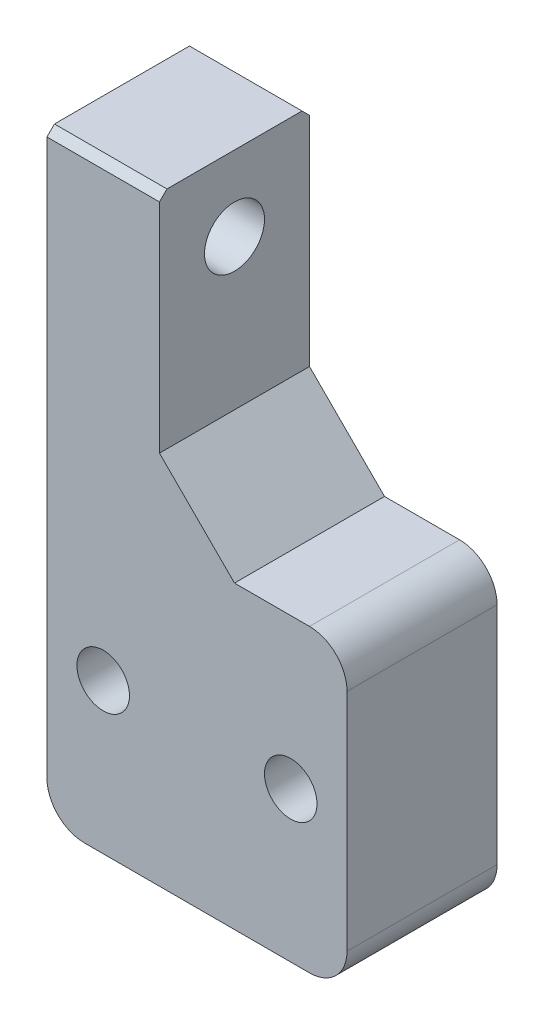
ISO-10303-21;
HEADER;
FILE_DESCRIPTION(('STEP AP214'),'2;1');
FILE_NAME('part.step','',(''),(''),'','','');
FILE_SCHEMA(('AUTOMOTIVE_DESIGN { 1 0 10303 214 1 1 1 1 }'));
ENDSEC;
DATA;
#1=APPLICATION_CONTEXT('core data for automotive mechanical design processes');
#2=APPLICATION_PROTOCOL_DEFINITION('international standard','automotive_design',2000,#1);
#3=PRODUCT_CONTEXT('',#1,'mechanical');
#4=PRODUCT('Part','Part','',(#3));
#5=PRODUCT_RELATED_PRODUCT_CATEGORY('part','',(#4));
#6=PRODUCT_DEFINITION_FORMATION('','',#4);
#7=PRODUCT_DEFINITION_CONTEXT('part definition',#1,'design');
#8=PRODUCT_DEFINITION('design','',#6,#7);
#9=PRODUCT_DEFINITION_SHAPE('','',#8);
#10=(LENGTH_UNIT() NAMED_UNIT(*) SI_UNIT(.MILLI.,.METRE.));
#11=(NAMED_UNIT(*) PLANE_ANGLE_UNIT() SI_UNIT($,.RADIAN.));
#12=(NAMED_UNIT(*) SI_UNIT($,.STERADIAN.) SOLID_ANGLE_UNIT());
#13=UNCERTAINTY_MEASURE_WITH_UNIT(LENGTH_MEASURE(1.E-05),#10,'distance_accuracy_value','');
#14=(GEOMETRIC_REPRESENTATION_CONTEXT(3) GLOBAL_UNCERTAINTY_ASSIGNED_CONTEXT((#13)) GLOBAL_UNIT_ASSIGNED_CONTEXT((#10,
#11,#12)) REPRESENTATION_CONTEXT('',''));
#15=CARTESIAN_POINT('',(0.,0.,0.));
#16=DIRECTION('',(0.,0.,1.));
#17=DIRECTION('',(1.,0.,0.));
#18=AXIS2_PLACEMENT_3D('',#15,#16,#17);
#19=CARTESIAN_POINT('',(0.,0.,20.));
#20=DIRECTION('',(1.,0.,0.));
#21=DIRECTION('',(0.,0.,-1.));
#22=AXIS2_PLACEMENT_3D('',#19,#20,#21);
#23=PLANE('',#22);
#24=CARTESIAN_POINT('',(0.,70.,10.));
#25=DIRECTION('',(1.,0.,0.));
#26=DIRECTION('',(0.,0.,-1.));
#27=AXIS2_PLACEMENT_3D('',#24,#25,#26);
#28=CIRCLE('',#27,4.);
#29=CARTESIAN_POINT('',(0.,70.,6.));
#30=VERTEX_POINT('',#29);
#31=EDGE_CURVE('E164',#30,#30,#28,.T.);
#32=ORIENTED_EDGE('',*,*,#31,.T.);
#33=EDGE_LOOP('',(#32));
#34=FACE_BOUND('',#33,.T.);
#35=DIRECTION('',(0.,-1.,0.));
#36=VECTOR('',#35,1.);
#37=CARTESIAN_POINT('',(0.,0.,20.));
#38=LINE('',#37,#36);
#39=CARTESIAN_POINT('',(0.,79.,20.));
#40=VERTEX_POINT('',#39);
#41=CARTESIAN_POINT('',(0.,5.,20.));
#42=VERTEX_POINT('',#41);
#43=EDGE_CURVE('E160',#40,#42,#38,.T.);
#44=ORIENTED_EDGE('',*,*,#43,.F.);
#45=DIRECTION('',(0.,0.707106781186548,-0.707106781186548));
#46=VECTOR('',#45,1.);
#47=CARTESIAN_POINT('',(0.,79.,20.));
#48=LINE('',#47,#46);
#49=CARTESIAN_POINT('',(0.,80.,19.));
#50=VERTEX_POINT('',#49);
#51=EDGE_CURVE('E198',#40,#50,#48,.T.);
#52=ORIENTED_EDGE('',*,*,#51,.T.);
#53=DIRECTION('',(0.,0.,1.));
#54=VECTOR('',#53,1.);
#55=CARTESIAN_POINT('',(0.,80.,0.));
#56=LINE('',#55,#54);
#57=CARTESIAN_POINT('',(0.,80.,0.999999999999987));
#58=VERTEX_POINT('',#57);
#59=EDGE_CURVE('E154',#58,#50,#56,.T.);
#60=ORIENTED_EDGE('',*,*,#59,.F.);
#61=DIRECTION('',(0.,0.707106781186552,0.707106781186543));
#62=VECTOR('',#61,1.);
#63=CARTESIAN_POINT('',(0.,80.,0.999999999999987));
#64=LINE('',#63,#62);
#65=CARTESIAN_POINT('',(0.,79.,0.));
#66=VERTEX_POINT('',#65);
#67=EDGE_CURVE('E196',#58,#66,#64,.F.);
#68=ORIENTED_EDGE('',*,*,#67,.T.);
#69=DIRECTION('',(0.,-1.,0.));
#70=VECTOR('',#69,1.);
#71=CARTESIAN_POINT('',(0.,0.,0.));
#72=LINE('',#71,#70);
#73=CARTESIAN_POINT('',(0.,5.,0.));
#74=VERTEX_POINT('',#73);
#75=EDGE_CURVE('E149',#66,#74,#72,.T.);
#76=ORIENTED_EDGE('',*,*,#75,.T.);
#77=DIRECTION('',(0.,0.,-1.));
#78=VECTOR('',#77,1.);
#79=CARTESIAN_POINT('',(0.,5.,20.));
#80=LINE('',#79,#78);
#81=EDGE_CURVE('E131',#74,#42,#80,.F.);
#82=ORIENTED_EDGE('',*,*,#81,.T.);
#83=EDGE_LOOP('',(#44,#52,#60,#68,#76,#82));
#84=FACE_BOUND('',#83,.T.);
#85=ADVANCED_FACE('F33',(#34,#84),#23,.F.);
#86=CARTESIAN_POINT('',(0.,0.,20.));
#87=DIRECTION('',(0.,1.,0.));
#88=DIRECTION('',(0.,0.,1.));
#89=AXIS2_PLACEMENT_3D('',#86,#87,#88);
#90=PLANE('',#89);
#91=DIRECTION('',(1.,0.,0.));
#92=VECTOR('',#91,1.);
#93=CARTESIAN_POINT('',(0.,0.,20.));
#94=LINE('',#93,#92);
#95=CARTESIAN_POINT('',(5.,0.,20.));
#96=VERTEX_POINT('',#95);
#97=CARTESIAN_POINT('',(35.,0.,20.));
#98=VERTEX_POINT('',#97);
#99=EDGE_CURVE('E142',#96,#98,#94,.T.);
#100=ORIENTED_EDGE('',*,*,#99,.F.);
#101=DIRECTION('',(0.,0.,-1.));
#102=VECTOR('',#101,1.);
#103=CARTESIAN_POINT('',(5.,0.,20.));
#104=LINE('',#103,#102);
#105=CARTESIAN_POINT('',(5.,0.,0.));
#106=VERTEX_POINT('',#105);
#107=EDGE_CURVE('E129',#96,#106,#104,.T.);
#108=ORIENTED_EDGE('',*,*,#107,.T.);
#109=DIRECTION('',(1.,0.,0.));
#110=VECTOR('',#109,1.);
#111=CARTESIAN_POINT('',(0.,0.,0.));
#112=LINE('',#111,#110);
#113=CARTESIAN_POINT('',(35.,0.,0.));
#114=VERTEX_POINT('',#113);
#115=EDGE_CURVE('E139',#106,#114,#112,.T.);
#116=ORIENTED_EDGE('',*,*,#115,.T.);
#117=DIRECTION('',(0.,0.,-1.));
#118=VECTOR('',#117,1.);
#119=CARTESIAN_POINT('',(35.,0.,20.));
#120=LINE('',#119,#118);
#121=EDGE_CURVE('E144',#114,#98,#120,.F.);
#122=ORIENTED_EDGE('',*,*,#121,.T.);
#123=EDGE_LOOP('',(#100,#108,#116,#122));
#124=FACE_BOUND('',#123,.T.);
#125=ADVANCED_FACE('F138',(#124),#90,.F.);
#126=CARTESIAN_POINT('',(40.,0.,20.));
#127=DIRECTION('',(-1.,0.,0.));
#128=DIRECTION('',(0.,0.,1.));
#129=AXIS2_PLACEMENT_3D('',#126,#127,#128);
#130=PLANE('',#129);
#131=DIRECTION('',(0.,1.,0.));
#132=VECTOR('',#131,1.);
#133=CARTESIAN_POINT('',(40.,0.,20.));
#134=LINE('',#133,#132);
#135=CARTESIAN_POINT('',(40.,5.,20.));
#136=VERTEX_POINT('',#135);
#137=CARTESIAN_POINT('',(40.,35.,20.));
#138=VERTEX_POINT('',#137);
#139=EDGE_CURVE('E233',#136,#138,#134,.T.);
#140=ORIENTED_EDGE('',*,*,#139,.F.);
#141=DIRECTION('',(0.,0.,-1.));
#142=VECTOR('',#141,1.);
#143=CARTESIAN_POINT('',(40.,5.,20.));
#144=LINE('',#143,#142);
#145=CARTESIAN_POINT('',(40.,5.,0.));
#146=VERTEX_POINT('',#145);
#147=EDGE_CURVE('E178',#136,#146,#144,.T.);
#148=ORIENTED_EDGE('',*,*,#147,.T.);
#149=DIRECTION('',(0.,1.,0.));
#150=VECTOR('',#149,1.);
#151=CARTESIAN_POINT('',(40.,0.,0.));
#152=LINE('',#151,#150);
#153=CARTESIAN_POINT('',(40.,35.,0.));
#154=VERTEX_POINT('',#153);
#155=EDGE_CURVE('E148',#146,#154,#152,.T.);
#156=ORIENTED_EDGE('',*,*,#155,.T.);
#157=DIRECTION('',(0.,0.,-1.));
#158=VECTOR('',#157,1.);
#159=CARTESIAN_POINT('',(40.,35.,20.));
#160=LINE('',#159,#158);
#161=EDGE_CURVE('E176',#154,#138,#160,.F.);
#162=ORIENTED_EDGE('',*,*,#161,.T.);
#163=EDGE_LOOP('',(#140,#148,#156,#162));
#164=FACE_BOUND('',#163,.T.);
#165=ADVANCED_FACE('F247',(#164),#130,.F.);
#166=CARTESIAN_POINT('',(0.,40.,20.));
#167=DIRECTION('',(0.,-1.,0.));
#168=DIRECTION('',(0.,0.,-1.));
#169=AXIS2_PLACEMENT_3D('',#166,#167,#168);
#170=PLANE('',#169);
#171=DIRECTION('',(-1.,0.,0.));
#172=VECTOR('',#171,1.);
#173=CARTESIAN_POINT('',(0.,40.,0.));
#174=LINE('',#173,#172);
#175=CARTESIAN_POINT('',(35.,40.,0.));
#176=VERTEX_POINT('',#175);
#177=CARTESIAN_POINT('',(25.0000000000001,40.,0.));
#178=VERTEX_POINT('',#177);
#179=EDGE_CURVE('E152',#176,#178,#174,.T.);
#180=ORIENTED_EDGE('',*,*,#179,.T.);
#181=DIRECTION('',(0.,0.,1.));
#182=VECTOR('',#181,1.);
#183=CARTESIAN_POINT('',(25.0000000000001,40.,20.));
#184=LINE('',#183,#182);
#185=CARTESIAN_POINT('',(25.0000000000001,40.,20.));
#186=VERTEX_POINT('',#185);
#187=EDGE_CURVE('E184',#178,#186,#184,.T.);
#188=ORIENTED_EDGE('',*,*,#187,.T.);
#189=DIRECTION('',(-1.,0.,0.));
#190=VECTOR('',#189,1.);
#191=CARTESIAN_POINT('',(0.,40.,20.));
#192=LINE('',#191,#190);
#193=CARTESIAN_POINT('',(35.,40.,20.));
#194=VERTEX_POINT('',#193);
#195=EDGE_CURVE('E165',#194,#186,#192,.T.);
#196=ORIENTED_EDGE('',*,*,#195,.F.);
#197=DIRECTION('',(0.,0.,-1.));
#198=VECTOR('',#197,1.);
#199=CARTESIAN_POINT('',(35.,40.,20.));
#200=LINE('',#199,#198);
#201=EDGE_CURVE('E181',#194,#176,#200,.T.);
#202=ORIENTED_EDGE('',*,*,#201,.T.);
#203=EDGE_LOOP('',(#180,#188,#196,#202));
#204=FACE_BOUND('',#203,.T.);
#205=ADVANCED_FACE('F239',(#204),#170,.F.);
#206=CARTESIAN_POINT('',(0.,0.,20.));
#207=DIRECTION('',(0.,0.,-1.));
#208=DIRECTION('',(-1.,0.,0.));
#209=AXIS2_PLACEMENT_3D('',#206,#207,#208);
#210=PLANE('',#209);
#211=CARTESIAN_POINT('',(32.5,20.,20.));
#212=DIRECTION('',(0.,0.,-1.));
#213=DIRECTION('',(-1.,0.,0.));
#214=AXIS2_PLACEMENT_3D('',#211,#212,#213);
#215=CIRCLE('',#214,3.5);
#216=CARTESIAN_POINT('',(29.,20.,20.));
#217=VERTEX_POINT('',#216);
#218=EDGE_CURVE('E261',#217,#217,#215,.T.);
#219=ORIENTED_EDGE('',*,*,#218,.T.);
#220=EDGE_LOOP('',(#219));
#221=FACE_BOUND('',#220,.T.);
#222=CARTESIAN_POINT('',(7.5,20.,20.));
#223=DIRECTION('',(0.,0.,-1.));
#224=DIRECTION('',(-1.,0.,0.));
#225=AXIS2_PLACEMENT_3D('',#222,#223,#224);
#226=CIRCLE('',#225,3.5);
#227=CARTESIAN_POINT('',(4.,20.,20.));
#228=VERTEX_POINT('',#227);
#229=EDGE_CURVE('E220',#228,#228,#226,.T.);
#230=ORIENTED_EDGE('',*,*,#229,.T.);
#231=EDGE_LOOP('',(#230));
#232=FACE_BOUND('',#231,.T.);
#233=DIRECTION('',(0.,1.,0.));
#234=VECTOR('',#233,1.);
#235=CARTESIAN_POINT('',(15.,40.,20.));
#236=LINE('',#235,#234);
#237=CARTESIAN_POINT('',(15.,50.,20.));
#238=VERTEX_POINT('',#237);
#239=CARTESIAN_POINT('',(15.,79.,20.));
#240=VERTEX_POINT('',#239);
#241=EDGE_CURVE('E210',#238,#240,#236,.T.);
#242=ORIENTED_EDGE('',*,*,#241,.T.);
#243=DIRECTION('',(-1.,0.,0.));
#244=VECTOR('',#243,1.);
#245=CARTESIAN_POINT('',(0.,79.,20.));
#246=LINE('',#245,#244);
#247=EDGE_CURVE('E193',#240,#40,#246,.T.);
#248=ORIENTED_EDGE('',*,*,#247,.T.);
#249=ORIENTED_EDGE('',*,*,#43,.T.);
#250=CARTESIAN_POINT('',(5.,5.,20.));
#251=DIRECTION('',(0.,0.,-1.));
#252=DIRECTION('',(-1.,0.,0.));
#253=AXIS2_PLACEMENT_3D('',#250,#251,#252);
#254=CIRCLE('',#253,5.);
#255=EDGE_CURVE('E174',#42,#96,#254,.F.);
#256=ORIENTED_EDGE('',*,*,#255,.T.);
#257=ORIENTED_EDGE('',*,*,#99,.T.);
#258=CARTESIAN_POINT('',(35.,5.,20.));
#259=DIRECTION('',(0.,0.,-1.));
#260=DIRECTION('',(-1.,0.,0.));
#261=AXIS2_PLACEMENT_3D('',#258,#259,#260);
#262=CIRCLE('',#261,5.);
#263=EDGE_CURVE('E172',#98,#136,#262,.F.);
#264=ORIENTED_EDGE('',*,*,#263,.T.);
#265=ORIENTED_EDGE('',*,*,#139,.T.);
#266=CARTESIAN_POINT('',(35.,35.,20.));
#267=DIRECTION('',(0.,0.,-1.));
#268=DIRECTION('',(-1.,0.,0.));
#269=AXIS2_PLACEMENT_3D('',#266,#267,#268);
#270=CIRCLE('',#269,5.);
#271=EDGE_CURVE('E170',#138,#194,#270,.F.);
#272=ORIENTED_EDGE('',*,*,#271,.T.);
#273=ORIENTED_EDGE('',*,*,#195,.T.);
#274=DIRECTION('',(-0.707106781186551,0.707106781186544,0.));
#275=VECTOR('',#274,1.);
#276=CARTESIAN_POINT('',(32.4999999999999,32.5000000000003,20.));
#277=LINE('',#276,#275);
#278=EDGE_CURVE('E189',#186,#238,#277,.T.);
#279=ORIENTED_EDGE('',*,*,#278,.T.);
#280=EDGE_LOOP('',(#242,#248,#249,#256,#257,#264,#265,#272,#273,#279));
#281=FACE_BOUND('',#280,.T.);
#282=ADVANCED_FACE('F216',(#221,#232,#281),#210,.F.);
#283=CARTESIAN_POINT('',(0.,0.,0.));
#284=DIRECTION('',(0.,0.,-1.));
#285=DIRECTION('',(-1.,0.,0.));
#286=AXIS2_PLACEMENT_3D('',#283,#284,#285);
#287=PLANE('',#286);
#288=CARTESIAN_POINT('',(32.5,20.,0.));
#289=DIRECTION('',(0.,0.,1.));
#290=DIRECTION('',(-1.,0.,0.));
#291=AXIS2_PLACEMENT_3D('',#288,#289,#290);
#292=CIRCLE('',#291,3.5);
#293=CARTESIAN_POINT('',(29.,20.,0.));
#294=VERTEX_POINT('',#293);
#295=EDGE_CURVE('E264',#294,#294,#292,.T.);
#296=ORIENTED_EDGE('',*,*,#295,.T.);
#297=EDGE_LOOP('',(#296));
#298=FACE_BOUND('',#297,.T.);
#299=CARTESIAN_POINT('',(7.5,20.,0.));
#300=DIRECTION('',(0.,0.,1.));
#301=DIRECTION('',(1.,0.,0.));
#302=AXIS2_PLACEMENT_3D('',#299,#300,#301);
#303=CIRCLE('',#302,3.5);
#304=CARTESIAN_POINT('',(11.,20.,0.));
#305=VERTEX_POINT('',#304);
#306=EDGE_CURVE('E258',#305,#305,#303,.T.);
#307=ORIENTED_EDGE('',*,*,#306,.T.);
#308=EDGE_LOOP('',(#307));
#309=FACE_BOUND('',#308,.T.);
#310=ORIENTED_EDGE('',*,*,#75,.F.);
#311=DIRECTION('',(1.,0.,0.));
#312=VECTOR('',#311,1.);
#313=CARTESIAN_POINT('',(0.,79.,0.));
#314=LINE('',#313,#312);
#315=CARTESIAN_POINT('',(15.,79.,0.));
#316=VERTEX_POINT('',#315);
#317=EDGE_CURVE('E11',#66,#316,#314,.T.);
#318=ORIENTED_EDGE('',*,*,#317,.T.);
#319=DIRECTION('',(0.,1.,0.));
#320=VECTOR('',#319,1.);
#321=CARTESIAN_POINT('',(15.,40.,0.));
#322=LINE('',#321,#320);
#323=CARTESIAN_POINT('',(15.,50.,0.));
#324=VERTEX_POINT('',#323);
#325=EDGE_CURVE('E219',#324,#316,#322,.T.);
#326=ORIENTED_EDGE('',*,*,#325,.F.);
#327=DIRECTION('',(0.707106781186551,-0.707106781186544,0.));
#328=VECTOR('',#327,1.);
#329=CARTESIAN_POINT('',(25.0000000000001,40.,0.));
#330=LINE('',#329,#328);
#331=EDGE_CURVE('E191',#324,#178,#330,.T.);
#332=ORIENTED_EDGE('',*,*,#331,.T.);
#333=ORIENTED_EDGE('',*,*,#179,.F.);
#334=CARTESIAN_POINT('',(35.,35.,0.));
#335=DIRECTION('',(0.,0.,-1.));
#336=DIRECTION('',(-1.,0.,0.));
#337=AXIS2_PLACEMENT_3D('',#334,#335,#336);
#338=CIRCLE('',#337,5.);
#339=EDGE_CURVE('E143',#176,#154,#338,.T.);
#340=ORIENTED_EDGE('',*,*,#339,.T.);
#341=ORIENTED_EDGE('',*,*,#155,.F.);
#342=CARTESIAN_POINT('',(35.,5.,0.));
#343=DIRECTION('',(0.,0.,-1.));
#344=DIRECTION('',(-1.,0.,0.));
#345=AXIS2_PLACEMENT_3D('',#342,#343,#344);
#346=CIRCLE('',#345,5.);
#347=EDGE_CURVE('E133',#146,#114,#346,.T.);
#348=ORIENTED_EDGE('',*,*,#347,.T.);
#349=ORIENTED_EDGE('',*,*,#115,.F.);
#350=CARTESIAN_POINT('',(5.,5.,0.));
#351=DIRECTION('',(0.,0.,-1.));
#352=DIRECTION('',(-1.,0.,0.));
#353=AXIS2_PLACEMENT_3D('',#350,#351,#352);
#354=CIRCLE('',#353,5.);
#355=EDGE_CURVE('E125',#106,#74,#354,.T.);
#356=ORIENTED_EDGE('',*,*,#355,.T.);
#357=EDGE_LOOP('',(#310,#318,#326,#332,#333,#340,#341,#348,#349,#356));
#358=FACE_BOUND('',#357,.T.);
#359=ADVANCED_FACE('F146',(#298,#309,#358),#287,.T.);
#360=CARTESIAN_POINT('',(0.,80.,0.));
#361=DIRECTION('',(0.,1.,0.));
#362=DIRECTION('',(0.,0.,1.));
#363=AXIS2_PLACEMENT_3D('',#360,#361,#362);
#364=PLANE('',#363);
#365=ORIENTED_EDGE('',*,*,#59,.T.);
#366=DIRECTION('',(1.,0.,0.));
#367=VECTOR('',#366,1.);
#368=CARTESIAN_POINT('',(15.,80.,19.));
#369=LINE('',#368,#367);
#370=CARTESIAN_POINT('',(15.,80.,19.));
#371=VERTEX_POINT('',#370);
#372=EDGE_CURVE('E54',#50,#371,#369,.T.);
#373=ORIENTED_EDGE('',*,*,#372,.T.);
#374=DIRECTION('',(0.,0.,1.));
#375=VECTOR('',#374,1.);
#376=CARTESIAN_POINT('',(15.,80.,0.));
#377=LINE('',#376,#375);
#378=CARTESIAN_POINT('',(15.,80.,0.999999999999987));
#379=VERTEX_POINT('',#378);
#380=EDGE_CURVE('E212',#379,#371,#377,.T.);
#381=ORIENTED_EDGE('',*,*,#380,.F.);
#382=DIRECTION('',(-1.,0.,0.));
#383=VECTOR('',#382,1.);
#384=CARTESIAN_POINT('',(0.,80.,0.999999999999987));
#385=LINE('',#384,#383);
#386=EDGE_CURVE('E200',#379,#58,#385,.T.);
#387=ORIENTED_EDGE('',*,*,#386,.T.);
#388=EDGE_LOOP('',(#365,#373,#381,#387));
#389=FACE_BOUND('',#388,.T.);
#390=ADVANCED_FACE('F225',(#389),#364,.T.);
#391=CARTESIAN_POINT('',(15.,40.,0.));
#392=DIRECTION('',(1.,0.,0.));
#393=DIRECTION('',(0.,0.,-1.));
#394=AXIS2_PLACEMENT_3D('',#391,#392,#393);
#395=PLANE('',#394);
#396=CARTESIAN_POINT('',(15.,70.,10.));
#397=DIRECTION('',(1.,0.,0.));
#398=DIRECTION('',(0.,0.,-1.));
#399=AXIS2_PLACEMENT_3D('',#396,#397,#398);
#400=CIRCLE('',#399,4.);
#401=CARTESIAN_POINT('',(15.,70.,6.));
#402=VERTEX_POINT('',#401);
#403=EDGE_CURVE('E161',#402,#402,#400,.T.);
#404=ORIENTED_EDGE('',*,*,#403,.F.);
#405=EDGE_LOOP('',(#404));
#406=FACE_BOUND('',#405,.T.);
#407=ORIENTED_EDGE('',*,*,#380,.T.);
#408=DIRECTION('',(0.,-0.707106781186548,0.707106781186548));
#409=VECTOR('',#408,1.);
#410=CARTESIAN_POINT('',(15.,69.5,29.5));
#411=LINE('',#410,#409);
#412=EDGE_CURVE('E41',#371,#240,#411,.T.);
#413=ORIENTED_EDGE('',*,*,#412,.T.);
#414=ORIENTED_EDGE('',*,*,#241,.F.);
#415=DIRECTION('',(0.,0.,-1.));
#416=VECTOR('',#415,1.);
#417=CARTESIAN_POINT('',(15.,50.,0.));
#418=LINE('',#417,#416);
#419=EDGE_CURVE('E187',#238,#324,#418,.T.);
#420=ORIENTED_EDGE('',*,*,#419,.T.);
#421=ORIENTED_EDGE('',*,*,#325,.T.);
#422=DIRECTION('',(0.,-0.707106781186552,-0.707106781186543));
#423=VECTOR('',#422,1.);
#424=CARTESIAN_POINT('',(15.,59.4999999999997,-19.5));
#425=LINE('',#424,#423);
#426=EDGE_CURVE('E204',#316,#379,#425,.F.);
#427=ORIENTED_EDGE('',*,*,#426,.T.);
#428=EDGE_LOOP('',(#407,#413,#414,#420,#421,#427));
#429=FACE_BOUND('',#428,.T.);
#430=ADVANCED_FACE('F209',(#406,#429),#395,.T.);
#431=CARTESIAN_POINT('',(7.5,20.,0.));
#432=DIRECTION('',(0.,0.,1.));
#433=DIRECTION('',(1.,0.,0.));
#434=AXIS2_PLACEMENT_3D('',#431,#432,#433);
#435=CYLINDRICAL_SURFACE('',#434,3.5);
#436=ORIENTED_EDGE('',*,*,#306,.F.);
#437=EDGE_LOOP('',(#436));
#438=FACE_BOUND('',#437,.T.);
#439=ORIENTED_EDGE('',*,*,#229,.F.);
#440=EDGE_LOOP('',(#439));
#441=FACE_BOUND('',#440,.T.);
#442=ADVANCED_FACE('F281',(#438,#441),#435,.F.);
#443=CARTESIAN_POINT('',(32.5,20.,0.));
#444=DIRECTION('',(0.,0.,1.));
#445=DIRECTION('',(1.,0.,0.));
#446=AXIS2_PLACEMENT_3D('',#443,#444,#445);
#447=CYLINDRICAL_SURFACE('',#446,3.5);
#448=ORIENTED_EDGE('',*,*,#295,.F.);
#449=EDGE_LOOP('',(#448));
#450=FACE_BOUND('',#449,.T.);
#451=ORIENTED_EDGE('',*,*,#218,.F.);
#452=EDGE_LOOP('',(#451));
#453=FACE_BOUND('',#452,.T.);
#454=ADVANCED_FACE('F273',(#450,#453),#447,.F.);
#455=CARTESIAN_POINT('',(40.,70.,10.));
#456=DIRECTION('',(-1.,0.,0.));
#457=DIRECTION('',(0.,0.,1.));
#458=AXIS2_PLACEMENT_3D('',#455,#456,#457);
#459=CYLINDRICAL_SURFACE('',#458,4.);
#460=ORIENTED_EDGE('',*,*,#403,.T.);
#461=EDGE_LOOP('',(#460));
#462=FACE_BOUND('',#461,.T.);
#463=ORIENTED_EDGE('',*,*,#31,.F.);
#464=EDGE_LOOP('',(#463));
#465=FACE_BOUND('',#464,.T.);
#466=ADVANCED_FACE('F271',(#462,#465),#459,.F.);
#467=CARTESIAN_POINT('',(5.,5.,20.));
#468=DIRECTION('',(0.,0.,-1.));
#469=DIRECTION('',(-1.,0.,0.));
#470=AXIS2_PLACEMENT_3D('',#467,#468,#469);
#471=CYLINDRICAL_SURFACE('',#470,5.);
#472=ORIENTED_EDGE('',*,*,#255,.F.);
#473=ORIENTED_EDGE('',*,*,#81,.F.);
#474=ORIENTED_EDGE('',*,*,#355,.F.);
#475=ORIENTED_EDGE('',*,*,#107,.F.);
#476=EDGE_LOOP('',(#472,#473,#474,#475));
#477=FACE_BOUND('',#476,.T.);
#478=ADVANCED_FACE('F128',(#477),#471,.T.);
#479=CARTESIAN_POINT('',(35.,5.,20.));
#480=DIRECTION('',(0.,0.,-1.));
#481=DIRECTION('',(-1.,0.,0.));
#482=AXIS2_PLACEMENT_3D('',#479,#480,#481);
#483=CYLINDRICAL_SURFACE('',#482,5.);
#484=ORIENTED_EDGE('',*,*,#263,.F.);
#485=ORIENTED_EDGE('',*,*,#121,.F.);
#486=ORIENTED_EDGE('',*,*,#347,.F.);
#487=ORIENTED_EDGE('',*,*,#147,.F.);
#488=EDGE_LOOP('',(#484,#485,#486,#487));
#489=FACE_BOUND('',#488,.T.);
#490=ADVANCED_FACE('F251',(#489),#483,.T.);
#491=CARTESIAN_POINT('',(35.,35.,20.));
#492=DIRECTION('',(0.,0.,-1.));
#493=DIRECTION('',(-1.,0.,0.));
#494=AXIS2_PLACEMENT_3D('',#491,#492,#493);
#495=CYLINDRICAL_SURFACE('',#494,5.);
#496=ORIENTED_EDGE('',*,*,#271,.F.);
#497=ORIENTED_EDGE('',*,*,#161,.F.);
#498=ORIENTED_EDGE('',*,*,#339,.F.);
#499=ORIENTED_EDGE('',*,*,#201,.F.);
#500=EDGE_LOOP('',(#496,#497,#498,#499));
#501=FACE_BOUND('',#500,.T.);
#502=ADVANCED_FACE('F243',(#501),#495,.T.);
#503=CARTESIAN_POINT('',(25.0000000000001,40.,20.));
#504=DIRECTION('',(-0.707106781186543,-0.707106781186551,0.));
#505=DIRECTION('',(0.,0.,1.));
#506=AXIS2_PLACEMENT_3D('',#503,#504,#505);
#507=PLANE('',#506);
#508=ORIENTED_EDGE('',*,*,#331,.F.);
#509=ORIENTED_EDGE('',*,*,#419,.F.);
#510=ORIENTED_EDGE('',*,*,#278,.F.);
#511=ORIENTED_EDGE('',*,*,#187,.F.);
#512=EDGE_LOOP('',(#508,#509,#510,#511));
#513=FACE_BOUND('',#512,.T.);
#514=ADVANCED_FACE('F296',(#513),#507,.F.);
#515=CARTESIAN_POINT('',(0.,79.,20.));
#516=DIRECTION('',(0.,0.707106781186547,0.707106781186547));
#517=DIRECTION('',(1.,0.,0.));
#518=AXIS2_PLACEMENT_3D('',#515,#516,#517);
#519=PLANE('',#518);
#520=ORIENTED_EDGE('',*,*,#412,.F.);
#521=ORIENTED_EDGE('',*,*,#372,.F.);
#522=ORIENTED_EDGE('',*,*,#51,.F.);
#523=ORIENTED_EDGE('',*,*,#247,.F.);
#524=EDGE_LOOP('',(#520,#521,#522,#523));
#525=FACE_BOUND('',#524,.T.);
#526=ADVANCED_FACE('F222',(#525),#519,.T.);
#527=CARTESIAN_POINT('',(0.,80.,0.999999999999987));
#528=DIRECTION('',(0.,-0.707106781186543,0.707106781186552));
#529=DIRECTION('',(-1.,0.,0.));
#530=AXIS2_PLACEMENT_3D('',#527,#528,#529);
#531=PLANE('',#530);
#532=ORIENTED_EDGE('',*,*,#426,.F.);
#533=ORIENTED_EDGE('',*,*,#317,.F.);
#534=ORIENTED_EDGE('',*,*,#67,.F.);
#535=ORIENTED_EDGE('',*,*,#386,.F.);
#536=EDGE_LOOP('',(#532,#533,#534,#535));
#537=FACE_BOUND('',#536,.T.);
#538=ADVANCED_FACE('F35',(#537),#531,.F.);
#539=CLOSED_SHELL('',(#85,#125,#165,#205,#282,#359,#390,#430,#442,#454,#466,#478,#490,#502,#514,
#526,#538));
#540=MANIFOLD_SOLID_BREP('B2',#539);
#541=ADVANCED_BREP_SHAPE_REPRESENTATION('',(#18,#540),#14);
#542=SHAPE_DEFINITION_REPRESENTATION(#9,#541);
ENDSEC;
END-ISO-10303-21;
